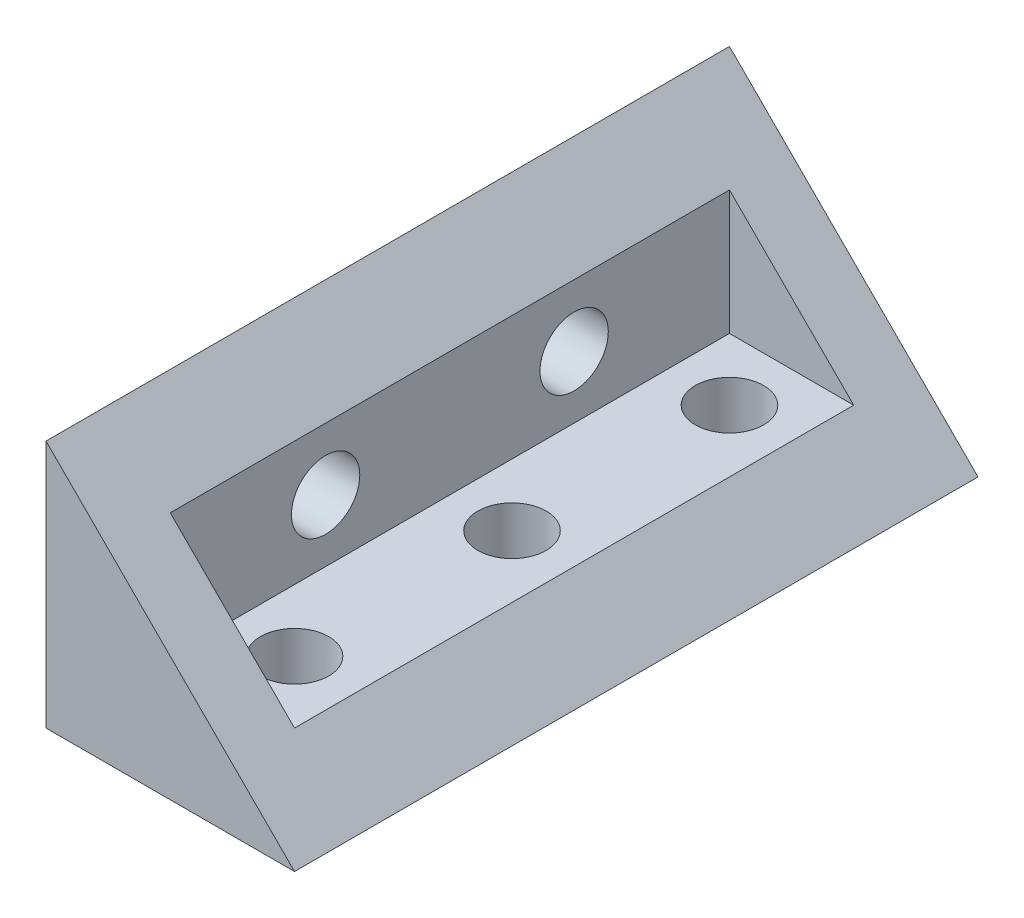
ISO-10303-21;
HEADER;
FILE_DESCRIPTION(('STEP AP214'),'2;1');
FILE_NAME('part.step','',(''),(''),'','','');
FILE_SCHEMA(('AUTOMOTIVE_DESIGN { 1 0 10303 214 1 1 1 1 }'));
ENDSEC;
DATA;
#1=APPLICATION_CONTEXT('core data for automotive mechanical design processes');
#2=APPLICATION_PROTOCOL_DEFINITION('international standard','automotive_design',2000,#1);
#3=PRODUCT_CONTEXT('',#1,'mechanical');
#4=PRODUCT('Part','Part','',(#3));
#5=PRODUCT_RELATED_PRODUCT_CATEGORY('part','',(#4));
#6=PRODUCT_DEFINITION_FORMATION('','',#4);
#7=PRODUCT_DEFINITION_CONTEXT('part definition',#1,'design');
#8=PRODUCT_DEFINITION('design','',#6,#7);
#9=PRODUCT_DEFINITION_SHAPE('','',#8);
#10=(LENGTH_UNIT() NAMED_UNIT(*) SI_UNIT(.MILLI.,.METRE.));
#11=(NAMED_UNIT(*) PLANE_ANGLE_UNIT() SI_UNIT($,.RADIAN.));
#12=(NAMED_UNIT(*) SI_UNIT($,.STERADIAN.) SOLID_ANGLE_UNIT());
#13=UNCERTAINTY_MEASURE_WITH_UNIT(LENGTH_MEASURE(1.E-05),#10,'distance_accuracy_value','');
#14=(GEOMETRIC_REPRESENTATION_CONTEXT(3) GLOBAL_UNCERTAINTY_ASSIGNED_CONTEXT((#13)) GLOBAL_UNIT_ASSIGNED_CONTEXT((#10,
#11,#12)) REPRESENTATION_CONTEXT('',''));
#15=CARTESIAN_POINT('',(0.,0.,0.));
#16=DIRECTION('',(0.,0.,1.));
#17=DIRECTION('',(1.,0.,0.));
#18=AXIS2_PLACEMENT_3D('',#15,#16,#17);
#19=CARTESIAN_POINT('',(-13.6944711538461,7.94999999999999,5.));
#20=DIRECTION('',(1.,0.,0.));
#21=DIRECTION('',(0.,1.,0.));
#22=AXIS2_PLACEMENT_3D('',#19,#20,#21);
#23=PLANE('',#22);
#24=CARTESIAN_POINT('',(-13.6944711538461,-2.05000000000001,17.5));
#25=DIRECTION('',(1.,0.,0.));
#26=DIRECTION('',(0.,1.,0.));
#27=AXIS2_PLACEMENT_3D('',#24,#25,#26);
#28=CIRCLE('',#27,2.75);
#29=CARTESIAN_POINT('',(-13.6944711538461,0.699999999999993,17.5));
#30=VERTEX_POINT('',#29);
#31=EDGE_CURVE('E115',#30,#30,#28,.F.);
#32=ORIENTED_EDGE('',*,*,#31,.F.);
#33=EDGE_LOOP('',(#32));
#34=FACE_BOUND('',#33,.T.);
#35=CARTESIAN_POINT('',(-13.6944711538461,-2.05000000000001,37.5));
#36=DIRECTION('',(1.,0.,0.));
#37=DIRECTION('',(0.,1.,0.));
#38=AXIS2_PLACEMENT_3D('',#35,#36,#37);
#39=CIRCLE('',#38,2.74999999999999);
#40=CARTESIAN_POINT('',(-13.6944711538461,0.699999999999989,37.5));
#41=VERTEX_POINT('',#40);
#42=EDGE_CURVE('E118',#41,#41,#39,.F.);
#43=ORIENTED_EDGE('',*,*,#42,.F.);
#44=EDGE_LOOP('',(#43));
#45=FACE_BOUND('',#44,.T.);
#46=DIRECTION('',(0.,-1.,0.));
#47=VECTOR('',#46,1.);
#48=CARTESIAN_POINT('',(-13.6944711538461,7.94999999999999,0.));
#49=LINE('',#48,#47);
#50=CARTESIAN_POINT('',(-13.6944711538461,7.94999999999999,0.));
#51=VERTEX_POINT('',#50);
#52=CARTESIAN_POINT('',(-13.6944711538461,-12.05,0.));
#53=VERTEX_POINT('',#52);
#54=EDGE_CURVE('E97',#51,#53,#49,.T.);
#55=ORIENTED_EDGE('',*,*,#54,.T.);
#56=DIRECTION('',(0.,0.,-1.));
#57=VECTOR('',#56,1.);
#58=CARTESIAN_POINT('',(-13.6944711538461,-12.05,5.));
#59=LINE('',#58,#57);
#60=CARTESIAN_POINT('',(-13.6944711538461,-12.05,55.));
#61=VERTEX_POINT('',#60);
#62=EDGE_CURVE('E11',#61,#53,#59,.T.);
#63=ORIENTED_EDGE('',*,*,#62,.F.);
#64=DIRECTION('',(0.,-1.,0.));
#65=VECTOR('',#64,1.);
#66=CARTESIAN_POINT('',(-13.6944711538461,-12.05,55.));
#67=LINE('',#66,#65);
#68=CARTESIAN_POINT('',(-13.6944711538461,7.94999999999999,55.));
#69=VERTEX_POINT('',#68);
#70=EDGE_CURVE('E95',#69,#61,#67,.T.);
#71=ORIENTED_EDGE('',*,*,#70,.F.);
#72=DIRECTION('',(0.,0.,-1.));
#73=VECTOR('',#72,1.);
#74=CARTESIAN_POINT('',(-13.6944711538461,7.94999999999999,5.));
#75=LINE('',#74,#73);
#76=EDGE_CURVE('E150',#69,#51,#75,.T.);
#77=ORIENTED_EDGE('',*,*,#76,.T.);
#78=EDGE_LOOP('',(#55,#63,#71,#77));
#79=FACE_BOUND('',#78,.T.);
#80=ADVANCED_FACE('F41',(#34,#45,#79),#23,.F.);
#81=CARTESIAN_POINT('',(-13.6944711538461,-12.05,5.));
#82=DIRECTION('',(0.,1.,0.));
#83=DIRECTION('',(0.,0.,1.));
#84=AXIS2_PLACEMENT_3D('',#81,#82,#83);
#85=PLANE('',#84);
#86=CARTESIAN_POINT('',(-3.69447115384614,-12.05,45.));
#87=DIRECTION('',(0.,1.,0.));
#88=DIRECTION('',(0.,0.,1.));
#89=AXIS2_PLACEMENT_3D('',#86,#87,#88);
#90=CIRCLE('',#89,2.75);
#91=CARTESIAN_POINT('',(-3.69447115384614,-12.05,47.75));
#92=VERTEX_POINT('',#91);
#93=EDGE_CURVE('E199',#92,#92,#90,.F.);
#94=ORIENTED_EDGE('',*,*,#93,.F.);
#95=EDGE_LOOP('',(#94));
#96=FACE_BOUND('',#95,.T.);
#97=CARTESIAN_POINT('',(-3.69447115384614,-12.05,27.5));
#98=DIRECTION('',(0.,1.,0.));
#99=DIRECTION('',(0.,0.,1.));
#100=AXIS2_PLACEMENT_3D('',#97,#98,#99);
#101=CIRCLE('',#100,2.75);
#102=CARTESIAN_POINT('',(-3.69447115384614,-12.05,30.25));
#103=VERTEX_POINT('',#102);
#104=EDGE_CURVE('E218',#103,#103,#101,.F.);
#105=ORIENTED_EDGE('',*,*,#104,.F.);
#106=EDGE_LOOP('',(#105));
#107=FACE_BOUND('',#106,.T.);
#108=CARTESIAN_POINT('',(-3.69447115384614,-12.05,10.));
#109=DIRECTION('',(0.,1.,0.));
#110=DIRECTION('',(0.,0.,1.));
#111=AXIS2_PLACEMENT_3D('',#108,#109,#110);
#112=CIRCLE('',#111,2.75);
#113=CARTESIAN_POINT('',(-3.69447115384614,-12.05,12.75));
#114=VERTEX_POINT('',#113);
#115=EDGE_CURVE('E209',#114,#114,#112,.F.);
#116=ORIENTED_EDGE('',*,*,#115,.F.);
#117=EDGE_LOOP('',(#116));
#118=FACE_BOUND('',#117,.T.);
#119=DIRECTION('',(1.,0.,0.));
#120=VECTOR('',#119,1.);
#121=CARTESIAN_POINT('',(-13.6944711538461,-12.05,0.));
#122=LINE('',#121,#120);
#123=CARTESIAN_POINT('',(6.30552884615386,-12.05,0.));
#124=VERTEX_POINT('',#123);
#125=EDGE_CURVE('E154',#53,#124,#122,.T.);
#126=ORIENTED_EDGE('',*,*,#125,.T.);
#127=DIRECTION('',(0.,0.,-1.));
#128=VECTOR('',#127,1.);
#129=CARTESIAN_POINT('',(6.30552884615386,-12.05,5.));
#130=LINE('',#129,#128);
#131=CARTESIAN_POINT('',(6.30552884615386,-12.05,55.));
#132=VERTEX_POINT('',#131);
#133=EDGE_CURVE('E49',#132,#124,#130,.T.);
#134=ORIENTED_EDGE('',*,*,#133,.F.);
#135=DIRECTION('',(1.,0.,0.));
#136=VECTOR('',#135,1.);
#137=CARTESIAN_POINT('',(6.30552884615386,-12.05,55.));
#138=LINE('',#137,#136);
#139=EDGE_CURVE('E100',#61,#132,#138,.T.);
#140=ORIENTED_EDGE('',*,*,#139,.F.);
#141=ORIENTED_EDGE('',*,*,#62,.T.);
#142=EDGE_LOOP('',(#126,#134,#140,#141));
#143=FACE_BOUND('',#142,.T.);
#144=ADVANCED_FACE('F101',(#96,#107,#118,#143),#85,.F.);
#145=CARTESIAN_POINT('',(-13.6944711538461,7.94999999999999,5.));
#146=DIRECTION('',(-0.707106781186547,-0.707106781186548,0.));
#147=DIRECTION('',(0.707106781186548,-0.707106781186547,0.));
#148=AXIS2_PLACEMENT_3D('',#145,#146,#147);
#149=PLANE('',#148);
#150=DIRECTION('',(0.,0.,-1.));
#151=VECTOR('',#150,1.);
#152=CARTESIAN_POINT('',(1.30552884615386,-7.05,50.));
#153=LINE('',#152,#151);
#154=CARTESIAN_POINT('',(1.30552884615386,-7.05,50.));
#155=VERTEX_POINT('',#154);
#156=CARTESIAN_POINT('',(1.30552884615386,-7.05,5.));
#157=VERTEX_POINT('',#156);
#158=EDGE_CURVE('E144',#155,#157,#153,.T.);
#159=ORIENTED_EDGE('',*,*,#158,.F.);
#160=DIRECTION('',(-0.707106781186548,0.707106781186547,0.));
#161=VECTOR('',#160,1.);
#162=CARTESIAN_POINT('',(-13.6944711538461,7.94999999999999,50.));
#163=LINE('',#162,#161);
#164=CARTESIAN_POINT('',(-8.69447115384614,2.94999999999999,50.));
#165=VERTEX_POINT('',#164);
#166=EDGE_CURVE('E111',#155,#165,#163,.T.);
#167=ORIENTED_EDGE('',*,*,#166,.T.);
#168=DIRECTION('',(0.,0.,-1.));
#169=VECTOR('',#168,1.);
#170=CARTESIAN_POINT('',(-8.69447115384614,2.95,50.));
#171=LINE('',#170,#169);
#172=CARTESIAN_POINT('',(-8.69447115384614,2.95,5.));
#173=VERTEX_POINT('',#172);
#174=EDGE_CURVE('E132',#165,#173,#171,.T.);
#175=ORIENTED_EDGE('',*,*,#174,.T.);
#176=DIRECTION('',(-0.707106781186548,0.707106781186547,0.));
#177=VECTOR('',#176,1.);
#178=CARTESIAN_POINT('',(-13.6944711538461,7.94999999999999,5.));
#179=LINE('',#178,#177);
#180=EDGE_CURVE('E56',#157,#173,#179,.T.);
#181=ORIENTED_EDGE('',*,*,#180,.F.);
#182=EDGE_LOOP('',(#159,#167,#175,#181));
#183=FACE_BOUND('',#182,.T.);
#184=DIRECTION('',(-0.707106781186548,0.707106781186547,0.));
#185=VECTOR('',#184,1.);
#186=CARTESIAN_POINT('',(-13.6944711538461,7.94999999999999,0.));
#187=LINE('',#186,#185);
#188=EDGE_CURVE('E151',#124,#51,#187,.T.);
#189=ORIENTED_EDGE('',*,*,#188,.T.);
#190=ORIENTED_EDGE('',*,*,#76,.F.);
#191=DIRECTION('',(-0.707106781186548,0.707106781186547,0.));
#192=VECTOR('',#191,1.);
#193=CARTESIAN_POINT('',(-13.6944711538461,7.94999999999999,55.));
#194=LINE('',#193,#192);
#195=EDGE_CURVE('E107',#132,#69,#194,.T.);
#196=ORIENTED_EDGE('',*,*,#195,.F.);
#197=ORIENTED_EDGE('',*,*,#133,.T.);
#198=EDGE_LOOP('',(#189,#190,#196,#197));
#199=FACE_BOUND('',#198,.T.);
#200=ADVANCED_FACE('F163',(#183,#199),#149,.F.);
#201=CARTESIAN_POINT('',(0.,0.,5.));
#202=DIRECTION('',(0.,0.,1.));
#203=DIRECTION('',(1.,0.,0.));
#204=AXIS2_PLACEMENT_3D('',#201,#202,#203);
#205=PLANE('',#204);
#206=DIRECTION('',(0.,1.,0.));
#207=VECTOR('',#206,1.);
#208=CARTESIAN_POINT('',(-8.69447115384614,-7.05000000000001,5.));
#209=LINE('',#208,#207);
#210=CARTESIAN_POINT('',(-8.69447115384614,-7.05000000000001,5.));
#211=VERTEX_POINT('',#210);
#212=EDGE_CURVE('E128',#211,#173,#209,.T.);
#213=ORIENTED_EDGE('',*,*,#212,.F.);
#214=DIRECTION('',(-1.,0.,0.));
#215=VECTOR('',#214,1.);
#216=CARTESIAN_POINT('',(1.30552884615386,-7.05,5.));
#217=LINE('',#216,#215);
#218=EDGE_CURVE('E60',#157,#211,#217,.T.);
#219=ORIENTED_EDGE('',*,*,#218,.F.);
#220=ORIENTED_EDGE('',*,*,#180,.T.);
#221=EDGE_LOOP('',(#213,#219,#220));
#222=FACE_BOUND('',#221,.T.);
#223=ADVANCED_FACE('F168',(#222),#205,.T.);
#224=CARTESIAN_POINT('',(0.,0.,0.));
#225=DIRECTION('',(0.,0.,1.));
#226=DIRECTION('',(1.,0.,0.));
#227=AXIS2_PLACEMENT_3D('',#224,#225,#226);
#228=PLANE('',#227);
#229=ORIENTED_EDGE('',*,*,#54,.F.);
#230=ORIENTED_EDGE('',*,*,#188,.F.);
#231=ORIENTED_EDGE('',*,*,#125,.F.);
#232=EDGE_LOOP('',(#229,#230,#231));
#233=FACE_BOUND('',#232,.T.);
#234=ADVANCED_FACE('F165',(#233),#228,.F.);
#235=CARTESIAN_POINT('',(1.30552884615386,-7.05,50.));
#236=DIRECTION('',(0.,-1.,0.));
#237=DIRECTION('',(1.,0.,0.));
#238=AXIS2_PLACEMENT_3D('',#235,#236,#237);
#239=PLANE('',#238);
#240=CARTESIAN_POINT('',(-3.69447115384614,-7.05,45.));
#241=DIRECTION('',(0.,1.,0.));
#242=DIRECTION('',(-1.,0.,0.));
#243=AXIS2_PLACEMENT_3D('',#240,#241,#242);
#244=CIRCLE('',#243,2.75);
#245=CARTESIAN_POINT('',(-6.44447115384615,-7.05,45.));
#246=VERTEX_POINT('',#245);
#247=EDGE_CURVE('E204',#246,#246,#244,.T.);
#248=ORIENTED_EDGE('',*,*,#247,.F.);
#249=EDGE_LOOP('',(#248));
#250=FACE_BOUND('',#249,.T.);
#251=CARTESIAN_POINT('',(-3.69447115384614,-7.05,27.5));
#252=DIRECTION('',(0.,1.,0.));
#253=DIRECTION('',(-1.,0.,0.));
#254=AXIS2_PLACEMENT_3D('',#251,#252,#253);
#255=CIRCLE('',#254,2.75);
#256=CARTESIAN_POINT('',(-6.44447115384614,-7.05,27.5));
#257=VERTEX_POINT('',#256);
#258=EDGE_CURVE('E213',#257,#257,#255,.T.);
#259=ORIENTED_EDGE('',*,*,#258,.F.);
#260=EDGE_LOOP('',(#259));
#261=FACE_BOUND('',#260,.T.);
#262=CARTESIAN_POINT('',(-3.69447115384614,-7.05,10.));
#263=DIRECTION('',(0.,1.,0.));
#264=DIRECTION('',(-1.,0.,0.));
#265=AXIS2_PLACEMENT_3D('',#262,#263,#264);
#266=CIRCLE('',#265,2.75);
#267=CARTESIAN_POINT('',(-6.44447115384614,-7.05,10.));
#268=VERTEX_POINT('',#267);
#269=EDGE_CURVE('E214',#268,#268,#266,.T.);
#270=ORIENTED_EDGE('',*,*,#269,.F.);
#271=EDGE_LOOP('',(#270));
#272=FACE_BOUND('',#271,.T.);
#273=ORIENTED_EDGE('',*,*,#218,.T.);
#274=DIRECTION('',(0.,0.,-1.));
#275=VECTOR('',#274,1.);
#276=CARTESIAN_POINT('',(-8.69447115384614,-7.05000000000001,50.));
#277=LINE('',#276,#275);
#278=CARTESIAN_POINT('',(-8.69447115384614,-7.05000000000001,50.));
#279=VERTEX_POINT('',#278);
#280=EDGE_CURVE('E140',#279,#211,#277,.T.);
#281=ORIENTED_EDGE('',*,*,#280,.F.);
#282=DIRECTION('',(-1.,0.,0.));
#283=VECTOR('',#282,1.);
#284=CARTESIAN_POINT('',(1.30552884615386,-7.05,50.));
#285=LINE('',#284,#283);
#286=EDGE_CURVE('E123',#155,#279,#285,.T.);
#287=ORIENTED_EDGE('',*,*,#286,.F.);
#288=ORIENTED_EDGE('',*,*,#158,.T.);
#289=EDGE_LOOP('',(#273,#281,#287,#288));
#290=FACE_BOUND('',#289,.T.);
#291=ADVANCED_FACE('F167',(#250,#261,#272,#290),#239,.F.);
#292=CARTESIAN_POINT('',(-8.69447115384614,-7.05000000000001,50.));
#293=DIRECTION('',(-1.,0.,0.));
#294=DIRECTION('',(0.,0.,1.));
#295=AXIS2_PLACEMENT_3D('',#292,#293,#294);
#296=PLANE('',#295);
#297=CARTESIAN_POINT('',(-8.69447115384614,-2.05000000000001,17.5));
#298=DIRECTION('',(1.,0.,0.));
#299=DIRECTION('',(0.,0.,-1.));
#300=AXIS2_PLACEMENT_3D('',#297,#298,#299);
#301=CIRCLE('',#300,2.75);
#302=CARTESIAN_POINT('',(-8.69447115384614,-2.05000000000001,14.75));
#303=VERTEX_POINT('',#302);
#304=EDGE_CURVE('E192',#303,#303,#301,.T.);
#305=ORIENTED_EDGE('',*,*,#304,.F.);
#306=EDGE_LOOP('',(#305));
#307=FACE_BOUND('',#306,.T.);
#308=CARTESIAN_POINT('',(-8.69447115384614,-2.05000000000001,37.5));
#309=DIRECTION('',(1.,0.,0.));
#310=DIRECTION('',(0.,0.,-1.));
#311=AXIS2_PLACEMENT_3D('',#308,#309,#310);
#312=CIRCLE('',#311,2.74999999999999);
#313=CARTESIAN_POINT('',(-8.69447115384614,-2.05000000000001,34.75));
#314=VERTEX_POINT('',#313);
#315=EDGE_CURVE('E193',#314,#314,#312,.T.);
#316=ORIENTED_EDGE('',*,*,#315,.F.);
#317=EDGE_LOOP('',(#316));
#318=FACE_BOUND('',#317,.T.);
#319=ORIENTED_EDGE('',*,*,#212,.T.);
#320=ORIENTED_EDGE('',*,*,#174,.F.);
#321=DIRECTION('',(0.,1.,0.));
#322=VECTOR('',#321,1.);
#323=CARTESIAN_POINT('',(-8.69447115384614,-7.05000000000001,50.));
#324=LINE('',#323,#322);
#325=EDGE_CURVE('E127',#279,#165,#324,.T.);
#326=ORIENTED_EDGE('',*,*,#325,.F.);
#327=ORIENTED_EDGE('',*,*,#280,.T.);
#328=EDGE_LOOP('',(#319,#320,#326,#327));
#329=FACE_BOUND('',#328,.T.);
#330=ADVANCED_FACE('F174',(#307,#318,#329),#296,.F.);
#331=CARTESIAN_POINT('',(0.,0.,50.));
#332=DIRECTION('',(0.,0.,1.));
#333=DIRECTION('',(1.,0.,0.));
#334=AXIS2_PLACEMENT_3D('',#331,#332,#333);
#335=PLANE('',#334);
#336=ORIENTED_EDGE('',*,*,#166,.F.);
#337=ORIENTED_EDGE('',*,*,#286,.T.);
#338=ORIENTED_EDGE('',*,*,#325,.T.);
#339=EDGE_LOOP('',(#336,#337,#338));
#340=FACE_BOUND('',#339,.T.);
#341=ADVANCED_FACE('F241',(#340),#335,.F.);
#342=CARTESIAN_POINT('',(0.,0.,55.));
#343=DIRECTION('',(0.,0.,1.));
#344=DIRECTION('',(1.,0.,0.));
#345=AXIS2_PLACEMENT_3D('',#342,#343,#344);
#346=PLANE('',#345);
#347=ORIENTED_EDGE('',*,*,#70,.T.);
#348=ORIENTED_EDGE('',*,*,#139,.T.);
#349=ORIENTED_EDGE('',*,*,#195,.T.);
#350=EDGE_LOOP('',(#347,#348,#349));
#351=FACE_BOUND('',#350,.T.);
#352=ADVANCED_FACE('F109',(#351),#346,.T.);
#353=CARTESIAN_POINT('',(-13.6954711538461,-2.05000000000001,37.5));
#354=DIRECTION('',(1.,0.,0.));
#355=DIRECTION('',(0.,0.,-1.));
#356=AXIS2_PLACEMENT_3D('',#353,#354,#355);
#357=CYLINDRICAL_SURFACE('',#356,2.74999999999999);
#358=ORIENTED_EDGE('',*,*,#315,.T.);
#359=EDGE_LOOP('',(#358));
#360=FACE_BOUND('',#359,.T.);
#361=ORIENTED_EDGE('',*,*,#42,.T.);
#362=EDGE_LOOP('',(#361));
#363=FACE_BOUND('',#362,.T.);
#364=ADVANCED_FACE('F310',(#360,#363),#357,.F.);
#365=CARTESIAN_POINT('',(-13.6954711538461,-2.05000000000001,17.5));
#366=DIRECTION('',(1.,0.,0.));
#367=DIRECTION('',(0.,0.,-1.));
#368=AXIS2_PLACEMENT_3D('',#365,#366,#367);
#369=CYLINDRICAL_SURFACE('',#368,2.75);
#370=ORIENTED_EDGE('',*,*,#304,.T.);
#371=EDGE_LOOP('',(#370));
#372=FACE_BOUND('',#371,.T.);
#373=ORIENTED_EDGE('',*,*,#31,.T.);
#374=EDGE_LOOP('',(#373));
#375=FACE_BOUND('',#374,.T.);
#376=ADVANCED_FACE('F315',(#372,#375),#369,.F.);
#377=CARTESIAN_POINT('',(-3.69447115384614,-12.051,10.));
#378=DIRECTION('',(0.,1.,0.));
#379=DIRECTION('',(-1.,0.,0.));
#380=AXIS2_PLACEMENT_3D('',#377,#378,#379);
#381=CYLINDRICAL_SURFACE('',#380,2.75);
#382=ORIENTED_EDGE('',*,*,#269,.T.);
#383=EDGE_LOOP('',(#382));
#384=FACE_BOUND('',#383,.T.);
#385=ORIENTED_EDGE('',*,*,#115,.T.);
#386=EDGE_LOOP('',(#385));
#387=FACE_BOUND('',#386,.T.);
#388=ADVANCED_FACE('F325',(#384,#387),#381,.F.);
#389=CARTESIAN_POINT('',(-3.69447115384614,-12.051,27.5));
#390=DIRECTION('',(0.,1.,0.));
#391=DIRECTION('',(-1.,0.,0.));
#392=AXIS2_PLACEMENT_3D('',#389,#390,#391);
#393=CYLINDRICAL_SURFACE('',#392,2.75);
#394=ORIENTED_EDGE('',*,*,#258,.T.);
#395=EDGE_LOOP('',(#394));
#396=FACE_BOUND('',#395,.T.);
#397=ORIENTED_EDGE('',*,*,#104,.T.);
#398=EDGE_LOOP('',(#397));
#399=FACE_BOUND('',#398,.T.);
#400=ADVANCED_FACE('F336',(#396,#399),#393,.F.);
#401=CARTESIAN_POINT('',(-3.69447115384614,-12.051,45.));
#402=DIRECTION('',(0.,1.,0.));
#403=DIRECTION('',(-1.,0.,0.));
#404=AXIS2_PLACEMENT_3D('',#401,#402,#403);
#405=CYLINDRICAL_SURFACE('',#404,2.75);
#406=ORIENTED_EDGE('',*,*,#247,.T.);
#407=EDGE_LOOP('',(#406));
#408=FACE_BOUND('',#407,.T.);
#409=ORIENTED_EDGE('',*,*,#93,.T.);
#410=EDGE_LOOP('',(#409));
#411=FACE_BOUND('',#410,.T.);
#412=ADVANCED_FACE('F229',(#408,#411),#405,.F.);
#413=CLOSED_SHELL('',(#80,#144,#200,#223,#234,#291,#330,#341,#352,#364,#376,#388,#400,#412));
#414=MANIFOLD_SOLID_BREP('B2',#413);
#415=ADVANCED_BREP_SHAPE_REPRESENTATION('',(#18,#414),#14);
#416=SHAPE_DEFINITION_REPRESENTATION(#9,#415);
ENDSEC;
END-ISO-10303-21;
